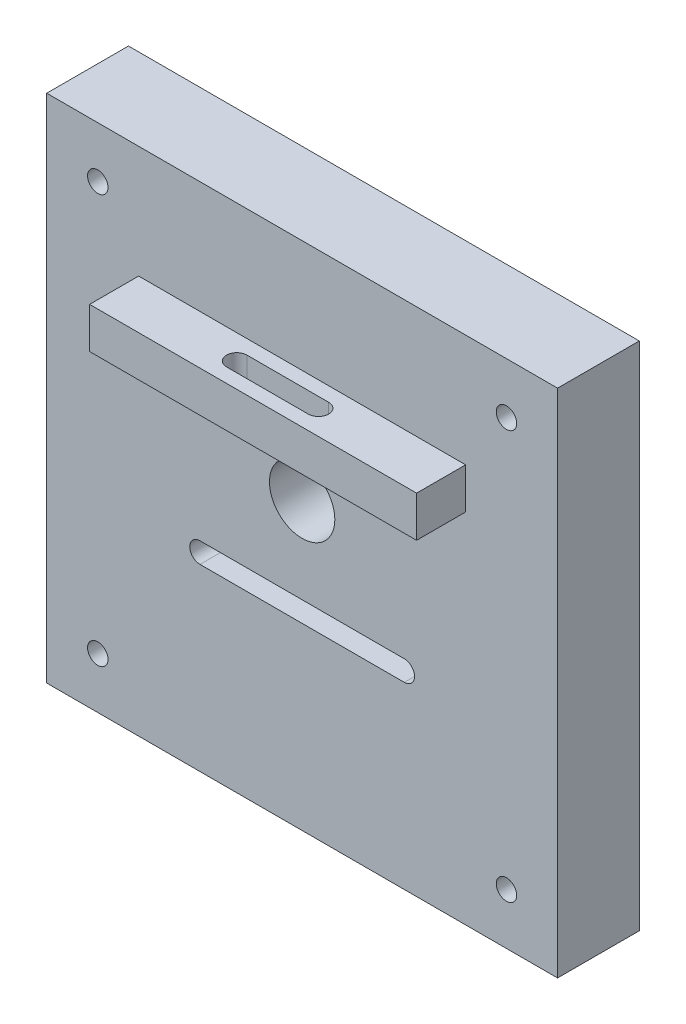
ISO-10303-21;
HEADER;
FILE_DESCRIPTION(('STEP AP214'),'2;1');
FILE_NAME('part.step','',(''),(''),'','','');
FILE_SCHEMA(('AUTOMOTIVE_DESIGN { 1 0 10303 214 1 1 1 1 }'));
ENDSEC;
DATA;
#1=APPLICATION_CONTEXT('core data for automotive mechanical design processes');
#2=APPLICATION_PROTOCOL_DEFINITION('international standard','automotive_design',2000,#1);
#3=PRODUCT_CONTEXT('',#1,'mechanical');
#4=PRODUCT('Part','Part','',(#3));
#5=PRODUCT_RELATED_PRODUCT_CATEGORY('part','',(#4));
#6=PRODUCT_DEFINITION_FORMATION('','',#4);
#7=PRODUCT_DEFINITION_CONTEXT('part definition',#1,'design');
#8=PRODUCT_DEFINITION('design','',#6,#7);
#9=PRODUCT_DEFINITION_SHAPE('','',#8);
#10=(LENGTH_UNIT() NAMED_UNIT(*) SI_UNIT(.MILLI.,.METRE.));
#11=(NAMED_UNIT(*) PLANE_ANGLE_UNIT() SI_UNIT($,.RADIAN.));
#12=(NAMED_UNIT(*) SI_UNIT($,.STERADIAN.) SOLID_ANGLE_UNIT());
#13=UNCERTAINTY_MEASURE_WITH_UNIT(LENGTH_MEASURE(1.E-05),#10,'distance_accuracy_value','');
#14=(GEOMETRIC_REPRESENTATION_CONTEXT(3) GLOBAL_UNCERTAINTY_ASSIGNED_CONTEXT((#13)) GLOBAL_UNIT_ASSIGNED_CONTEXT((#10,
#11,#12)) REPRESENTATION_CONTEXT('',''));
#15=CARTESIAN_POINT('',(0.,0.,0.));
#16=DIRECTION('',(0.,0.,1.));
#17=DIRECTION('',(1.,0.,0.));
#18=AXIS2_PLACEMENT_3D('',#15,#16,#17);
#19=CARTESIAN_POINT('',(0.,0.,20.));
#20=DIRECTION('',(0.,0.,1.));
#21=DIRECTION('',(1.,0.,0.));
#22=AXIS2_PLACEMENT_3D('',#19,#20,#21);
#23=PLANE('',#22);
#24=CARTESIAN_POINT('',(-20.8251473477407,-14.8721021611002,20.));
#25=DIRECTION('',(0.,0.,1.));
#26=DIRECTION('',(1.,0.,0.));
#27=AXIS2_PLACEMENT_3D('',#24,#25,#26);
#28=CIRCLE('',#27,2.5);
#29=CARTESIAN_POINT('',(-20.8251473477407,-12.3721021611002,20.));
#30=VERTEX_POINT('',#29);
#31=CARTESIAN_POINT('',(-20.8251473477407,-17.3721021611002,20.));
#32=VERTEX_POINT('',#31);
#33=EDGE_CURVE('E293',#30,#32,#28,.T.);
#34=ORIENTED_EDGE('',*,*,#33,.F.);
#35=DIRECTION('',(-1.,0.,0.));
#36=VECTOR('',#35,1.);
#37=CARTESIAN_POINT('',(-20.8251473477407,-12.3721021611002,20.));
#38=LINE('',#37,#36);
#39=CARTESIAN_POINT('',(29.1748526522593,-12.3721021611002,20.));
#40=VERTEX_POINT('',#39);
#41=EDGE_CURVE('E303',#40,#30,#38,.T.);
#42=ORIENTED_EDGE('',*,*,#41,.F.);
#43=CARTESIAN_POINT('',(29.1748526522593,-14.8721021611002,20.));
#44=DIRECTION('',(0.,0.,1.));
#45=DIRECTION('',(-1.,0.,0.));
#46=AXIS2_PLACEMENT_3D('',#43,#44,#45);
#47=CIRCLE('',#46,2.5);
#48=CARTESIAN_POINT('',(29.1748526522593,-17.3721021611002,20.));
#49=VERTEX_POINT('',#48);
#50=EDGE_CURVE('E300',#49,#40,#47,.T.);
#51=ORIENTED_EDGE('',*,*,#50,.F.);
#52=DIRECTION('',(1.,0.,0.));
#53=VECTOR('',#52,1.);
#54=CARTESIAN_POINT('',(29.1748526522593,-17.3721021611002,20.));
#55=LINE('',#54,#53);
#56=EDGE_CURVE('E296',#32,#49,#55,.T.);
#57=ORIENTED_EDGE('',*,*,#56,.F.);
#58=EDGE_LOOP('',(#34,#42,#51,#57));
#59=FACE_BOUND('',#58,.T.);
#60=CARTESIAN_POINT('',(4.17485265225931,8.6278978388998,20.));
#61=DIRECTION('',(0.,0.,1.));
#62=DIRECTION('',(1.,0.,0.));
#63=AXIS2_PLACEMENT_3D('',#60,#61,#62);
#64=CIRCLE('',#63,8.);
#65=CARTESIAN_POINT('',(12.1748526522593,8.6278978388998,20.));
#66=VERTEX_POINT('',#65);
#67=EDGE_CURVE('E292',#66,#66,#64,.T.);
#68=ORIENTED_EDGE('',*,*,#67,.F.);
#69=EDGE_LOOP('',(#68));
#70=FACE_BOUND('',#69,.T.);
#71=CARTESIAN_POINT('',(-45.8251473477397,-48.7721021611002,20.));
#72=DIRECTION('',(0.,0.,1.));
#73=DIRECTION('',(1.,0.,0.));
#74=AXIS2_PLACEMENT_3D('',#71,#72,#73);
#75=CIRCLE('',#74,2.5);
#76=CARTESIAN_POINT('',(-43.3251473477397,-48.7721021611002,20.));
#77=VERTEX_POINT('',#76);
#78=EDGE_CURVE('E309',#77,#77,#75,.T.);
#79=ORIENTED_EDGE('',*,*,#78,.F.);
#80=EDGE_LOOP('',(#79));
#81=FACE_BOUND('',#80,.T.);
#82=CARTESIAN_POINT('',(54.1748526522604,-48.7721021611002,20.));
#83=DIRECTION('',(0.,0.,1.));
#84=DIRECTION('',(1.,0.,0.));
#85=AXIS2_PLACEMENT_3D('',#82,#83,#84);
#86=CIRCLE('',#85,2.5);
#87=CARTESIAN_POINT('',(56.6748526522604,-48.7721021611002,20.));
#88=VERTEX_POINT('',#87);
#89=EDGE_CURVE('E329',#88,#88,#86,.T.);
#90=ORIENTED_EDGE('',*,*,#89,.F.);
#91=EDGE_LOOP('',(#90));
#92=FACE_BOUND('',#91,.T.);
#93=CARTESIAN_POINT('',(54.1748526522593,51.2278978388998,20.));
#94=DIRECTION('',(0.,0.,1.));
#95=DIRECTION('',(1.,0.,0.));
#96=AXIS2_PLACEMENT_3D('',#93,#94,#95);
#97=CIRCLE('',#96,2.5);
#98=CARTESIAN_POINT('',(56.6748526522593,51.2278978388998,20.));
#99=VERTEX_POINT('',#98);
#100=EDGE_CURVE('E323',#99,#99,#97,.T.);
#101=ORIENTED_EDGE('',*,*,#100,.F.);
#102=EDGE_LOOP('',(#101));
#103=FACE_BOUND('',#102,.T.);
#104=CARTESIAN_POINT('',(-45.8251473477407,51.2278978388998,20.));
#105=DIRECTION('',(0.,0.,1.));
#106=DIRECTION('',(1.,0.,0.));
#107=AXIS2_PLACEMENT_3D('',#104,#105,#106);
#108=CIRCLE('',#107,2.5);
#109=CARTESIAN_POINT('',(-43.3251473477407,51.2278978388998,20.));
#110=VERTEX_POINT('',#109);
#111=EDGE_CURVE('E322',#110,#110,#108,.T.);
#112=ORIENTED_EDGE('',*,*,#111,.F.);
#113=EDGE_LOOP('',(#112));
#114=FACE_BOUND('',#113,.T.);
#115=DIRECTION('',(0.,-1.,0.));
#116=VECTOR('',#115,1.);
#117=CARTESIAN_POINT('',(-58.3251473477407,63.7278978388998,20.));
#118=LINE('',#117,#116);
#119=CARTESIAN_POINT('',(-58.3251473477407,63.7278978388998,20.));
#120=VERTEX_POINT('',#119);
#121=CARTESIAN_POINT('',(-58.3251473477407,-61.2721021611002,20.));
#122=VERTEX_POINT('',#121);
#123=EDGE_CURVE('E343',#120,#122,#118,.T.);
#124=ORIENTED_EDGE('',*,*,#123,.T.);
#125=DIRECTION('',(1.,0.,0.));
#126=VECTOR('',#125,1.);
#127=CARTESIAN_POINT('',(-58.3251473477407,-61.2721021611002,20.));
#128=LINE('',#127,#126);
#129=CARTESIAN_POINT('',(66.6748526522593,-61.2721021611002,20.));
#130=VERTEX_POINT('',#129);
#131=EDGE_CURVE('E346',#122,#130,#128,.T.);
#132=ORIENTED_EDGE('',*,*,#131,.T.);
#133=DIRECTION('',(0.,1.,0.));
#134=VECTOR('',#133,1.);
#135=CARTESIAN_POINT('',(66.6748526522593,63.7278978388998,20.));
#136=LINE('',#135,#134);
#137=CARTESIAN_POINT('',(66.6748526522593,63.7278978388998,20.));
#138=VERTEX_POINT('',#137);
#139=EDGE_CURVE('E349',#130,#138,#136,.T.);
#140=ORIENTED_EDGE('',*,*,#139,.T.);
#141=DIRECTION('',(-1.,0.,0.));
#142=VECTOR('',#141,1.);
#143=CARTESIAN_POINT('',(-58.3251473477407,63.7278978388998,20.));
#144=LINE('',#143,#142);
#145=EDGE_CURVE('E351',#138,#120,#144,.T.);
#146=ORIENTED_EDGE('',*,*,#145,.T.);
#147=EDGE_LOOP('',(#124,#132,#140,#146));
#148=FACE_BOUND('',#147,.T.);
#149=DIRECTION('',(1.,0.,0.));
#150=VECTOR('',#149,1.);
#151=CARTESIAN_POINT('',(-35.8251473477407,26.2278978388998,20.));
#152=LINE('',#151,#150);
#153=CARTESIAN_POINT('',(-35.8251473477407,26.2278978388998,20.));
#154=VERTEX_POINT('',#153);
#155=CARTESIAN_POINT('',(44.1748526522593,26.2278978388998,20.));
#156=VERTEX_POINT('',#155);
#157=EDGE_CURVE('E247',#154,#156,#152,.T.);
#158=ORIENTED_EDGE('',*,*,#157,.F.);
#159=DIRECTION('',(0.,-1.,0.));
#160=VECTOR('',#159,1.);
#161=CARTESIAN_POINT('',(-35.8251473477407,26.2278978388998,20.));
#162=LINE('',#161,#160);
#163=CARTESIAN_POINT('',(-35.8251473477407,36.2278978388998,20.));
#164=VERTEX_POINT('',#163);
#165=EDGE_CURVE('E233',#164,#154,#162,.T.);
#166=ORIENTED_EDGE('',*,*,#165,.F.);
#167=DIRECTION('',(-1.,0.,0.));
#168=VECTOR('',#167,1.);
#169=CARTESIAN_POINT('',(-35.8251473477407,36.2278978388998,20.));
#170=LINE('',#169,#168);
#171=CARTESIAN_POINT('',(44.1748526522593,36.2278978388998,20.));
#172=VERTEX_POINT('',#171);
#173=EDGE_CURVE('E238',#172,#164,#170,.T.);
#174=ORIENTED_EDGE('',*,*,#173,.F.);
#175=DIRECTION('',(0.,1.,0.));
#176=VECTOR('',#175,1.);
#177=CARTESIAN_POINT('',(44.1748526522593,26.2278978388998,20.));
#178=LINE('',#177,#176);
#179=EDGE_CURVE('E249',#156,#172,#178,.T.);
#180=ORIENTED_EDGE('',*,*,#179,.F.);
#181=EDGE_LOOP('',(#158,#166,#174,#180));
#182=FACE_BOUND('',#181,.T.);
#183=ADVANCED_FACE('F36',(#59,#70,#81,#92,#103,#114,#148,#182),#23,.T.);
#184=CARTESIAN_POINT('',(-20.8251473477407,-14.8721021611002,0.));
#185=DIRECTION('',(0.,0.,1.));
#186=DIRECTION('',(1.,0.,0.));
#187=AXIS2_PLACEMENT_3D('',#184,#185,#186);
#188=CYLINDRICAL_SURFACE('',#187,2.5);
#189=CARTESIAN_POINT('',(-20.8251473477407,-14.8721021611002,10.));
#190=DIRECTION('',(0.,0.,-1.));
#191=DIRECTION('',(-1.,0.,0.));
#192=AXIS2_PLACEMENT_3D('',#189,#190,#191);
#193=CIRCLE('',#192,2.5);
#194=CARTESIAN_POINT('',(-20.8251473477407,-12.3721021611002,10.));
#195=VERTEX_POINT('',#194);
#196=CARTESIAN_POINT('',(-20.8251473477407,-17.3721021611002,10.));
#197=VERTEX_POINT('',#196);
#198=EDGE_CURVE('E290',#195,#197,#193,.F.);
#199=ORIENTED_EDGE('',*,*,#198,.F.);
#200=DIRECTION('',(0.,0.,1.));
#201=VECTOR('',#200,1.);
#202=CARTESIAN_POINT('',(-20.8251473477407,-12.3721021611002,0.));
#203=LINE('',#202,#201);
#204=EDGE_CURVE('E307',#195,#30,#203,.T.);
#205=ORIENTED_EDGE('',*,*,#204,.T.);
#206=ORIENTED_EDGE('',*,*,#33,.T.);
#207=DIRECTION('',(0.,0.,1.));
#208=VECTOR('',#207,1.);
#209=CARTESIAN_POINT('',(-20.8251473477407,-17.3721021611002,0.));
#210=LINE('',#209,#208);
#211=EDGE_CURVE('E306',#197,#32,#210,.T.);
#212=ORIENTED_EDGE('',*,*,#211,.F.);
#213=EDGE_LOOP('',(#199,#205,#206,#212));
#214=FACE_BOUND('',#213,.T.);
#215=ADVANCED_FACE('F456',(#214),#188,.F.);
#216=CARTESIAN_POINT('',(-20.8251473477407,-12.3721021611002,0.));
#217=DIRECTION('',(0.,1.,0.));
#218=DIRECTION('',(-1.,0.,0.));
#219=AXIS2_PLACEMENT_3D('',#216,#217,#218);
#220=PLANE('',#219);
#221=DIRECTION('',(-1.,0.,0.));
#222=VECTOR('',#221,1.);
#223=CARTESIAN_POINT('',(-20.8251473477407,-12.3721021611002,10.));
#224=LINE('',#223,#222);
#225=CARTESIAN_POINT('',(29.1748526522593,-12.3721021611002,10.));
#226=VERTEX_POINT('',#225);
#227=EDGE_CURVE('E288',#226,#195,#224,.T.);
#228=ORIENTED_EDGE('',*,*,#227,.F.);
#229=DIRECTION('',(0.,0.,1.));
#230=VECTOR('',#229,1.);
#231=CARTESIAN_POINT('',(29.1748526522593,-12.3721021611002,0.));
#232=LINE('',#231,#230);
#233=EDGE_CURVE('E310',#226,#40,#232,.T.);
#234=ORIENTED_EDGE('',*,*,#233,.T.);
#235=ORIENTED_EDGE('',*,*,#41,.T.);
#236=ORIENTED_EDGE('',*,*,#204,.F.);
#237=EDGE_LOOP('',(#228,#234,#235,#236));
#238=FACE_BOUND('',#237,.T.);
#239=ADVANCED_FACE('F462',(#238),#220,.F.);
#240=CARTESIAN_POINT('',(29.1748526522593,-14.8721021611002,0.));
#241=DIRECTION('',(0.,0.,1.));
#242=DIRECTION('',(1.,0.,0.));
#243=AXIS2_PLACEMENT_3D('',#240,#241,#242);
#244=CYLINDRICAL_SURFACE('',#243,2.5);
#245=CARTESIAN_POINT('',(29.1748526522593,-14.8721021611002,10.));
#246=DIRECTION('',(0.,0.,-1.));
#247=DIRECTION('',(-1.,0.,0.));
#248=AXIS2_PLACEMENT_3D('',#245,#246,#247);
#249=CIRCLE('',#248,2.5);
#250=CARTESIAN_POINT('',(29.1748526522593,-17.3721021611002,10.));
#251=VERTEX_POINT('',#250);
#252=EDGE_CURVE('E276',#251,#226,#249,.F.);
#253=ORIENTED_EDGE('',*,*,#252,.F.);
#254=DIRECTION('',(0.,0.,1.));
#255=VECTOR('',#254,1.);
#256=CARTESIAN_POINT('',(29.1748526522593,-17.3721021611002,0.));
#257=LINE('',#256,#255);
#258=EDGE_CURVE('E312',#251,#49,#257,.T.);
#259=ORIENTED_EDGE('',*,*,#258,.T.);
#260=ORIENTED_EDGE('',*,*,#50,.T.);
#261=ORIENTED_EDGE('',*,*,#233,.F.);
#262=EDGE_LOOP('',(#253,#259,#260,#261));
#263=FACE_BOUND('',#262,.T.);
#264=ADVANCED_FACE('F491',(#263),#244,.F.);
#265=CARTESIAN_POINT('',(29.1748526522593,-17.3721021611002,0.));
#266=DIRECTION('',(0.,-1.,0.));
#267=DIRECTION('',(1.,0.,0.));
#268=AXIS2_PLACEMENT_3D('',#265,#266,#267);
#269=PLANE('',#268);
#270=DIRECTION('',(1.,0.,0.));
#271=VECTOR('',#270,1.);
#272=CARTESIAN_POINT('',(29.1748526522593,-17.3721021611002,10.));
#273=LINE('',#272,#271);
#274=EDGE_CURVE('E372',#197,#251,#273,.T.);
#275=ORIENTED_EDGE('',*,*,#274,.F.);
#276=ORIENTED_EDGE('',*,*,#211,.T.);
#277=ORIENTED_EDGE('',*,*,#56,.T.);
#278=ORIENTED_EDGE('',*,*,#258,.F.);
#279=EDGE_LOOP('',(#275,#276,#277,#278));
#280=FACE_BOUND('',#279,.T.);
#281=ADVANCED_FACE('F486',(#280),#269,.F.);
#282=CARTESIAN_POINT('',(-58.3251473477407,63.7278978388998,20.));
#283=DIRECTION('',(1.,0.,0.));
#284=DIRECTION('',(0.,0.,-1.));
#285=AXIS2_PLACEMENT_3D('',#282,#283,#284);
#286=PLANE('',#285);
#287=DIRECTION('',(0.,-1.,0.));
#288=VECTOR('',#287,1.);
#289=CARTESIAN_POINT('',(-58.3251473477407,63.7278978388998,0.));
#290=LINE('',#289,#288);
#291=CARTESIAN_POINT('',(-58.3251473477407,63.7278978388998,0.));
#292=VERTEX_POINT('',#291);
#293=CARTESIAN_POINT('',(-58.3251473477407,-61.2721021611002,0.));
#294=VERTEX_POINT('',#293);
#295=EDGE_CURVE('E340',#292,#294,#290,.T.);
#296=ORIENTED_EDGE('',*,*,#295,.T.);
#297=DIRECTION('',(0.,0.,-1.));
#298=VECTOR('',#297,1.);
#299=CARTESIAN_POINT('',(-58.3251473477407,-61.2721021611002,20.));
#300=LINE('',#299,#298);
#301=EDGE_CURVE('E369',#122,#294,#300,.T.);
#302=ORIENTED_EDGE('',*,*,#301,.F.);
#303=ORIENTED_EDGE('',*,*,#123,.F.);
#304=DIRECTION('',(0.,0.,-1.));
#305=VECTOR('',#304,1.);
#306=CARTESIAN_POINT('',(-58.3251473477407,63.7278978388998,20.));
#307=LINE('',#306,#305);
#308=EDGE_CURVE('E353',#120,#292,#307,.T.);
#309=ORIENTED_EDGE('',*,*,#308,.T.);
#310=EDGE_LOOP('',(#296,#302,#303,#309));
#311=FACE_BOUND('',#310,.T.);
#312=ADVANCED_FACE('F483',(#311),#286,.F.);
#313=CARTESIAN_POINT('',(-58.3251473477407,-61.2721021611002,20.));
#314=DIRECTION('',(0.,1.,0.));
#315=DIRECTION('',(-1.,0.,0.));
#316=AXIS2_PLACEMENT_3D('',#313,#314,#315);
#317=PLANE('',#316);
#318=DIRECTION('',(1.,0.,0.));
#319=VECTOR('',#318,1.);
#320=CARTESIAN_POINT('',(-58.3251473477407,-61.2721021611002,0.));
#321=LINE('',#320,#319);
#322=CARTESIAN_POINT('',(66.6748526522593,-61.2721021611002,0.));
#323=VERTEX_POINT('',#322);
#324=EDGE_CURVE('E356',#294,#323,#321,.T.);
#325=ORIENTED_EDGE('',*,*,#324,.T.);
#326=DIRECTION('',(0.,0.,-1.));
#327=VECTOR('',#326,1.);
#328=CARTESIAN_POINT('',(66.6748526522593,-61.2721021611002,20.));
#329=LINE('',#328,#327);
#330=EDGE_CURVE('E366',#130,#323,#329,.T.);
#331=ORIENTED_EDGE('',*,*,#330,.F.);
#332=ORIENTED_EDGE('',*,*,#131,.F.);
#333=ORIENTED_EDGE('',*,*,#301,.T.);
#334=EDGE_LOOP('',(#325,#331,#332,#333));
#335=FACE_BOUND('',#334,.T.);
#336=ADVANCED_FACE('F480',(#335),#317,.F.);
#337=CARTESIAN_POINT('',(66.6748526522593,63.7278978388998,20.));
#338=DIRECTION('',(-1.,0.,0.));
#339=DIRECTION('',(0.,-1.,0.));
#340=AXIS2_PLACEMENT_3D('',#337,#338,#339);
#341=PLANE('',#340);
#342=DIRECTION('',(0.,1.,0.));
#343=VECTOR('',#342,1.);
#344=CARTESIAN_POINT('',(66.6748526522593,63.7278978388998,0.));
#345=LINE('',#344,#343);
#346=CARTESIAN_POINT('',(66.6748526522593,63.7278978388998,0.));
#347=VERTEX_POINT('',#346);
#348=EDGE_CURVE('E358',#323,#347,#345,.T.);
#349=ORIENTED_EDGE('',*,*,#348,.T.);
#350=DIRECTION('',(0.,0.,-1.));
#351=VECTOR('',#350,1.);
#352=CARTESIAN_POINT('',(66.6748526522593,63.7278978388998,20.));
#353=LINE('',#352,#351);
#354=EDGE_CURVE('E363',#138,#347,#353,.T.);
#355=ORIENTED_EDGE('',*,*,#354,.F.);
#356=ORIENTED_EDGE('',*,*,#139,.F.);
#357=ORIENTED_EDGE('',*,*,#330,.T.);
#358=EDGE_LOOP('',(#349,#355,#356,#357));
#359=FACE_BOUND('',#358,.T.);
#360=ADVANCED_FACE('F476',(#359),#341,.F.);
#361=CARTESIAN_POINT('',(-58.3251473477407,63.7278978388998,20.));
#362=DIRECTION('',(0.,-1.,0.));
#363=DIRECTION('',(0.,0.,-1.));
#364=AXIS2_PLACEMENT_3D('',#361,#362,#363);
#365=PLANE('',#364);
#366=DIRECTION('',(-1.,0.,0.));
#367=VECTOR('',#366,1.);
#368=CARTESIAN_POINT('',(-58.3251473477407,63.7278978388998,0.));
#369=LINE('',#368,#367);
#370=EDGE_CURVE('E347',#347,#292,#369,.T.);
#371=ORIENTED_EDGE('',*,*,#370,.T.);
#372=ORIENTED_EDGE('',*,*,#308,.F.);
#373=ORIENTED_EDGE('',*,*,#145,.F.);
#374=ORIENTED_EDGE('',*,*,#354,.T.);
#375=EDGE_LOOP('',(#371,#372,#373,#374));
#376=FACE_BOUND('',#375,.T.);
#377=ADVANCED_FACE('F473',(#376),#365,.F.);
#378=CARTESIAN_POINT('',(0.,0.,0.));
#379=DIRECTION('',(0.,0.,1.));
#380=DIRECTION('',(1.,0.,0.));
#381=AXIS2_PLACEMENT_3D('',#378,#379,#380);
#382=PLANE('',#381);
#383=DIRECTION('',(-1.,0.,0.));
#384=VECTOR('',#383,1.);
#385=CARTESIAN_POINT('',(39.1748526522593,-22.3721021611002,0.));
#386=LINE('',#385,#384);
#387=CARTESIAN_POINT('',(34.1748526522593,-22.3721021611002,0.));
#388=VERTEX_POINT('',#387);
#389=CARTESIAN_POINT('',(-25.8251473477407,-22.3721021611002,0.));
#390=VERTEX_POINT('',#389);
#391=EDGE_CURVE('E279',#388,#390,#386,.T.);
#392=ORIENTED_EDGE('',*,*,#391,.F.);
#393=CARTESIAN_POINT('',(34.1748526522593,-17.3721021611002,0.));
#394=DIRECTION('',(0.,0.,1.));
#395=DIRECTION('',(1.,0.,0.));
#396=AXIS2_PLACEMENT_3D('',#393,#394,#395);
#397=CIRCLE('',#396,5.);
#398=CARTESIAN_POINT('',(39.1748526522593,-17.3721021611002,0.));
#399=VERTEX_POINT('',#398);
#400=EDGE_CURVE('E404',#388,#399,#397,.T.);
#401=ORIENTED_EDGE('',*,*,#400,.T.);
#402=DIRECTION('',(0.,-1.,0.));
#403=VECTOR('',#402,1.);
#404=CARTESIAN_POINT('',(39.1748526522593,-7.3721021611002,0.));
#405=LINE('',#404,#403);
#406=CARTESIAN_POINT('',(39.1748526522593,-12.3721021611002,0.));
#407=VERTEX_POINT('',#406);
#408=EDGE_CURVE('E262',#407,#399,#405,.T.);
#409=ORIENTED_EDGE('',*,*,#408,.F.);
#410=CARTESIAN_POINT('',(34.1748526522593,-12.3721021611002,0.));
#411=DIRECTION('',(0.,0.,1.));
#412=DIRECTION('',(1.,0.,0.));
#413=AXIS2_PLACEMENT_3D('',#410,#411,#412);
#414=CIRCLE('',#413,5.);
#415=CARTESIAN_POINT('',(34.1748526522593,-7.3721021611002,0.));
#416=VERTEX_POINT('',#415);
#417=EDGE_CURVE('E11',#407,#416,#414,.T.);
#418=ORIENTED_EDGE('',*,*,#417,.T.);
#419=DIRECTION('',(1.,0.,0.));
#420=VECTOR('',#419,1.);
#421=CARTESIAN_POINT('',(39.1748526522593,-7.3721021611002,0.));
#422=LINE('',#421,#420);
#423=CARTESIAN_POINT('',(-25.8251473477407,-7.37210216110019,0.));
#424=VERTEX_POINT('',#423);
#425=EDGE_CURVE('E267',#424,#416,#422,.T.);
#426=ORIENTED_EDGE('',*,*,#425,.F.);
#427=CARTESIAN_POINT('',(-25.8251473477407,-12.3721021611002,0.));
#428=DIRECTION('',(0.,0.,1.));
#429=DIRECTION('',(1.,0.,0.));
#430=AXIS2_PLACEMENT_3D('',#427,#428,#429);
#431=CIRCLE('',#430,5.);
#432=CARTESIAN_POINT('',(-30.8251473477407,-12.3721021611002,0.));
#433=VERTEX_POINT('',#432);
#434=EDGE_CURVE('E44',#424,#433,#431,.T.);
#435=ORIENTED_EDGE('',*,*,#434,.T.);
#436=DIRECTION('',(0.,1.,0.));
#437=VECTOR('',#436,1.);
#438=CARTESIAN_POINT('',(-30.8251473477407,-7.37210216110019,0.));
#439=LINE('',#438,#437);
#440=CARTESIAN_POINT('',(-30.8251473477407,-17.3721021611002,0.));
#441=VERTEX_POINT('',#440);
#442=EDGE_CURVE('E282',#441,#433,#439,.T.);
#443=ORIENTED_EDGE('',*,*,#442,.F.);
#444=CARTESIAN_POINT('',(-25.8251473477407,-17.3721021611002,0.));
#445=DIRECTION('',(0.,0.,1.));
#446=DIRECTION('',(1.,0.,0.));
#447=AXIS2_PLACEMENT_3D('',#444,#445,#446);
#448=CIRCLE('',#447,5.);
#449=EDGE_CURVE('E402',#441,#390,#448,.T.);
#450=ORIENTED_EDGE('',*,*,#449,.T.);
#451=EDGE_LOOP('',(#392,#401,#409,#418,#426,#435,#443,#450));
#452=FACE_BOUND('',#451,.T.);
#453=CARTESIAN_POINT('',(4.17485265225931,8.6278978388998,0.));
#454=DIRECTION('',(0.,0.,1.));
#455=DIRECTION('',(1.,0.,0.));
#456=AXIS2_PLACEMENT_3D('',#453,#454,#455);
#457=CIRCLE('',#456,8.);
#458=CARTESIAN_POINT('',(12.1748526522593,8.6278978388998,0.));
#459=VERTEX_POINT('',#458);
#460=EDGE_CURVE('E297',#459,#459,#457,.T.);
#461=ORIENTED_EDGE('',*,*,#460,.T.);
#462=EDGE_LOOP('',(#461));
#463=FACE_BOUND('',#462,.T.);
#464=CARTESIAN_POINT('',(-45.8251473477397,-48.7721021611002,0.));
#465=DIRECTION('',(0.,0.,1.));
#466=DIRECTION('',(1.,0.,0.));
#467=AXIS2_PLACEMENT_3D('',#464,#465,#466);
#468=CIRCLE('',#467,2.5);
#469=CARTESIAN_POINT('',(-43.3251473477397,-48.7721021611002,0.));
#470=VERTEX_POINT('',#469);
#471=EDGE_CURVE('E332',#470,#470,#468,.T.);
#472=ORIENTED_EDGE('',*,*,#471,.T.);
#473=EDGE_LOOP('',(#472));
#474=FACE_BOUND('',#473,.T.);
#475=CARTESIAN_POINT('',(54.1748526522604,-48.7721021611002,0.));
#476=DIRECTION('',(0.,0.,1.));
#477=DIRECTION('',(1.,0.,0.));
#478=AXIS2_PLACEMENT_3D('',#475,#476,#477);
#479=CIRCLE('',#478,2.5);
#480=CARTESIAN_POINT('',(56.6748526522604,-48.7721021611002,0.));
#481=VERTEX_POINT('',#480);
#482=EDGE_CURVE('E326',#481,#481,#479,.T.);
#483=ORIENTED_EDGE('',*,*,#482,.T.);
#484=EDGE_LOOP('',(#483));
#485=FACE_BOUND('',#484,.T.);
#486=CARTESIAN_POINT('',(54.1748526522593,51.2278978388998,0.));
#487=DIRECTION('',(0.,0.,1.));
#488=DIRECTION('',(1.,0.,0.));
#489=AXIS2_PLACEMENT_3D('',#486,#487,#488);
#490=CIRCLE('',#489,2.5);
#491=CARTESIAN_POINT('',(56.6748526522593,51.2278978388998,0.));
#492=VERTEX_POINT('',#491);
#493=EDGE_CURVE('E319',#492,#492,#490,.T.);
#494=ORIENTED_EDGE('',*,*,#493,.T.);
#495=EDGE_LOOP('',(#494));
#496=FACE_BOUND('',#495,.T.);
#497=CARTESIAN_POINT('',(-45.8251473477407,51.2278978388998,0.));
#498=DIRECTION('',(0.,0.,1.));
#499=DIRECTION('',(1.,0.,0.));
#500=AXIS2_PLACEMENT_3D('',#497,#498,#499);
#501=CIRCLE('',#500,2.5);
#502=CARTESIAN_POINT('',(-43.3251473477407,51.2278978388998,0.));
#503=VERTEX_POINT('',#502);
#504=EDGE_CURVE('E337',#503,#503,#501,.T.);
#505=ORIENTED_EDGE('',*,*,#504,.T.);
#506=EDGE_LOOP('',(#505));
#507=FACE_BOUND('',#506,.T.);
#508=ORIENTED_EDGE('',*,*,#295,.F.);
#509=ORIENTED_EDGE('',*,*,#370,.F.);
#510=ORIENTED_EDGE('',*,*,#348,.F.);
#511=ORIENTED_EDGE('',*,*,#324,.F.);
#512=EDGE_LOOP('',(#508,#509,#510,#511));
#513=FACE_BOUND('',#512,.T.);
#514=ADVANCED_FACE('F409',(#452,#463,#474,#485,#496,#507,#513),#382,.F.);
#515=CARTESIAN_POINT('',(-45.8251473477407,51.2278978388998,0.));
#516=DIRECTION('',(0.,0.,1.));
#517=DIRECTION('',(1.,0.,0.));
#518=AXIS2_PLACEMENT_3D('',#515,#516,#517);
#519=CYLINDRICAL_SURFACE('',#518,2.5);
#520=ORIENTED_EDGE('',*,*,#504,.F.);
#521=EDGE_LOOP('',(#520));
#522=FACE_BOUND('',#521,.T.);
#523=ORIENTED_EDGE('',*,*,#111,.T.);
#524=EDGE_LOOP('',(#523));
#525=FACE_BOUND('',#524,.T.);
#526=ADVANCED_FACE('F469',(#522,#525),#519,.F.);
#527=CARTESIAN_POINT('',(54.1748526522593,51.2278978388998,0.));
#528=DIRECTION('',(0.,0.,1.));
#529=DIRECTION('',(1.,0.,0.));
#530=AXIS2_PLACEMENT_3D('',#527,#528,#529);
#531=CYLINDRICAL_SURFACE('',#530,2.5);
#532=ORIENTED_EDGE('',*,*,#493,.F.);
#533=EDGE_LOOP('',(#532));
#534=FACE_BOUND('',#533,.T.);
#535=ORIENTED_EDGE('',*,*,#100,.T.);
#536=EDGE_LOOP('',(#535));
#537=FACE_BOUND('',#536,.T.);
#538=ADVANCED_FACE('F561',(#534,#537),#531,.F.);
#539=CARTESIAN_POINT('',(54.1748526522604,-48.7721021611002,0.));
#540=DIRECTION('',(0.,0.,1.));
#541=DIRECTION('',(1.,0.,0.));
#542=AXIS2_PLACEMENT_3D('',#539,#540,#541);
#543=CYLINDRICAL_SURFACE('',#542,2.5);
#544=ORIENTED_EDGE('',*,*,#482,.F.);
#545=EDGE_LOOP('',(#544));
#546=FACE_BOUND('',#545,.T.);
#547=ORIENTED_EDGE('',*,*,#89,.T.);
#548=EDGE_LOOP('',(#547));
#549=FACE_BOUND('',#548,.T.);
#550=ADVANCED_FACE('F564',(#546,#549),#543,.F.);
#551=CARTESIAN_POINT('',(-45.8251473477397,-48.7721021611002,0.));
#552=DIRECTION('',(0.,0.,1.));
#553=DIRECTION('',(1.,0.,0.));
#554=AXIS2_PLACEMENT_3D('',#551,#552,#553);
#555=CYLINDRICAL_SURFACE('',#554,2.5);
#556=ORIENTED_EDGE('',*,*,#471,.F.);
#557=EDGE_LOOP('',(#556));
#558=FACE_BOUND('',#557,.T.);
#559=ORIENTED_EDGE('',*,*,#78,.T.);
#560=EDGE_LOOP('',(#559));
#561=FACE_BOUND('',#560,.T.);
#562=ADVANCED_FACE('F559',(#558,#561),#555,.F.);
#563=CARTESIAN_POINT('',(4.17485265225931,8.6278978388998,0.));
#564=DIRECTION('',(0.,0.,1.));
#565=DIRECTION('',(1.,0.,0.));
#566=AXIS2_PLACEMENT_3D('',#563,#564,#565);
#567=CYLINDRICAL_SURFACE('',#566,8.);
#568=ORIENTED_EDGE('',*,*,#460,.F.);
#569=EDGE_LOOP('',(#568));
#570=FACE_BOUND('',#569,.T.);
#571=ORIENTED_EDGE('',*,*,#67,.T.);
#572=EDGE_LOOP('',(#571));
#573=FACE_BOUND('',#572,.T.);
#574=ADVANCED_FACE('F544',(#570,#573),#567,.F.);
#575=CARTESIAN_POINT('',(0.,0.,10.));
#576=DIRECTION('',(0.,0.,-1.));
#577=DIRECTION('',(-1.,0.,0.));
#578=AXIS2_PLACEMENT_3D('',#575,#576,#577);
#579=PLANE('',#578);
#580=DIRECTION('',(-1.,0.,0.));
#581=VECTOR('',#580,1.);
#582=CARTESIAN_POINT('',(39.1748526522593,-22.3721021611002,10.));
#583=LINE('',#582,#581);
#584=CARTESIAN_POINT('',(34.1748526522593,-22.3721021611002,10.));
#585=VERTEX_POINT('',#584);
#586=CARTESIAN_POINT('',(-25.8251473477407,-22.3721021611002,10.));
#587=VERTEX_POINT('',#586);
#588=EDGE_CURVE('E266',#585,#587,#583,.T.);
#589=ORIENTED_EDGE('',*,*,#588,.T.);
#590=CARTESIAN_POINT('',(-25.8251473477407,-17.3721021611002,10.));
#591=DIRECTION('',(0.,0.,-1.));
#592=DIRECTION('',(-1.,0.,0.));
#593=AXIS2_PLACEMENT_3D('',#590,#591,#592);
#594=CIRCLE('',#593,5.);
#595=CARTESIAN_POINT('',(-30.8251473477407,-17.3721021611002,10.));
#596=VERTEX_POINT('',#595);
#597=EDGE_CURVE('E390',#587,#596,#594,.T.);
#598=ORIENTED_EDGE('',*,*,#597,.T.);
#599=DIRECTION('',(0.,1.,0.));
#600=VECTOR('',#599,1.);
#601=CARTESIAN_POINT('',(-30.8251473477407,-7.37210216110019,10.));
#602=LINE('',#601,#600);
#603=CARTESIAN_POINT('',(-30.8251473477407,-12.3721021611002,10.));
#604=VERTEX_POINT('',#603);
#605=EDGE_CURVE('E270',#596,#604,#602,.T.);
#606=ORIENTED_EDGE('',*,*,#605,.T.);
#607=CARTESIAN_POINT('',(-25.8251473477407,-12.3721021611002,10.));
#608=DIRECTION('',(0.,0.,-1.));
#609=DIRECTION('',(-1.,0.,0.));
#610=AXIS2_PLACEMENT_3D('',#607,#608,#609);
#611=CIRCLE('',#610,5.);
#612=CARTESIAN_POINT('',(-25.8251473477407,-7.37210216110019,10.));
#613=VERTEX_POINT('',#612);
#614=EDGE_CURVE('E386',#604,#613,#611,.T.);
#615=ORIENTED_EDGE('',*,*,#614,.T.);
#616=DIRECTION('',(1.,0.,0.));
#617=VECTOR('',#616,1.);
#618=CARTESIAN_POINT('',(39.1748526522593,-7.3721021611002,10.));
#619=LINE('',#618,#617);
#620=CARTESIAN_POINT('',(34.1748526522593,-7.3721021611002,10.));
#621=VERTEX_POINT('',#620);
#622=EDGE_CURVE('E273',#613,#621,#619,.T.);
#623=ORIENTED_EDGE('',*,*,#622,.T.);
#624=CARTESIAN_POINT('',(34.1748526522593,-12.3721021611002,10.));
#625=DIRECTION('',(0.,0.,-1.));
#626=DIRECTION('',(-1.,0.,0.));
#627=AXIS2_PLACEMENT_3D('',#624,#625,#626);
#628=CIRCLE('',#627,5.);
#629=CARTESIAN_POINT('',(39.1748526522593,-12.3721021611002,10.));
#630=VERTEX_POINT('',#629);
#631=EDGE_CURVE('E384',#621,#630,#628,.T.);
#632=ORIENTED_EDGE('',*,*,#631,.T.);
#633=DIRECTION('',(0.,-1.,0.));
#634=VECTOR('',#633,1.);
#635=CARTESIAN_POINT('',(39.1748526522593,-7.3721021611002,10.));
#636=LINE('',#635,#634);
#637=CARTESIAN_POINT('',(39.1748526522593,-17.3721021611002,10.));
#638=VERTEX_POINT('',#637);
#639=EDGE_CURVE('E263',#630,#638,#636,.T.);
#640=ORIENTED_EDGE('',*,*,#639,.T.);
#641=CARTESIAN_POINT('',(34.1748526522593,-17.3721021611002,10.));
#642=DIRECTION('',(0.,0.,-1.));
#643=DIRECTION('',(-1.,0.,0.));
#644=AXIS2_PLACEMENT_3D('',#641,#642,#643);
#645=CIRCLE('',#644,5.);
#646=EDGE_CURVE('E388',#638,#585,#645,.T.);
#647=ORIENTED_EDGE('',*,*,#646,.T.);
#648=EDGE_LOOP('',(#589,#598,#606,#615,#623,#632,#640,#647));
#649=FACE_BOUND('',#648,.T.);
#650=ORIENTED_EDGE('',*,*,#198,.T.);
#651=ORIENTED_EDGE('',*,*,#274,.T.);
#652=ORIENTED_EDGE('',*,*,#252,.T.);
#653=ORIENTED_EDGE('',*,*,#227,.T.);
#654=EDGE_LOOP('',(#650,#651,#652,#653));
#655=FACE_BOUND('',#654,.T.);
#656=ADVANCED_FACE('F422',(#649,#655),#579,.T.);
#657=CARTESIAN_POINT('',(39.1748526522593,-7.3721021611002,10.));
#658=DIRECTION('',(1.,0.,0.));
#659=DIRECTION('',(0.,1.,0.));
#660=AXIS2_PLACEMENT_3D('',#657,#658,#659);
#661=PLANE('',#660);
#662=ORIENTED_EDGE('',*,*,#408,.T.);
#663=DIRECTION('',(0.,0.,-1.));
#664=VECTOR('',#663,1.);
#665=CARTESIAN_POINT('',(39.1748526522593,-17.3721021611002,10.));
#666=LINE('',#665,#664);
#667=EDGE_CURVE('E395',#399,#638,#666,.F.);
#668=ORIENTED_EDGE('',*,*,#667,.T.);
#669=ORIENTED_EDGE('',*,*,#639,.F.);
#670=DIRECTION('',(0.,0.,-1.));
#671=VECTOR('',#670,1.);
#672=CARTESIAN_POINT('',(39.1748526522593,-12.3721021611002,0.));
#673=LINE('',#672,#671);
#674=EDGE_CURVE('E392',#630,#407,#673,.T.);
#675=ORIENTED_EDGE('',*,*,#674,.T.);
#676=EDGE_LOOP('',(#662,#668,#669,#675));
#677=FACE_BOUND('',#676,.T.);
#678=ADVANCED_FACE('F433',(#677),#661,.F.);
#679=CARTESIAN_POINT('',(39.1748526522593,-7.3721021611002,10.));
#680=DIRECTION('',(0.,1.,0.));
#681=DIRECTION('',(-1.,0.,0.));
#682=AXIS2_PLACEMENT_3D('',#679,#680,#681);
#683=PLANE('',#682);
#684=ORIENTED_EDGE('',*,*,#622,.F.);
#685=DIRECTION('',(0.,0.,-1.));
#686=VECTOR('',#685,1.);
#687=CARTESIAN_POINT('',(-25.8251473477407,-7.37210216110019,0.));
#688=LINE('',#687,#686);
#689=EDGE_CURVE('E399',#613,#424,#688,.T.);
#690=ORIENTED_EDGE('',*,*,#689,.T.);
#691=ORIENTED_EDGE('',*,*,#425,.T.);
#692=DIRECTION('',(0.,0.,-1.));
#693=VECTOR('',#692,1.);
#694=CARTESIAN_POINT('',(34.1748526522593,-7.3721021611002,10.));
#695=LINE('',#694,#693);
#696=EDGE_CURVE('E397',#416,#621,#695,.F.);
#697=ORIENTED_EDGE('',*,*,#696,.T.);
#698=EDGE_LOOP('',(#684,#690,#691,#697));
#699=FACE_BOUND('',#698,.T.);
#700=ADVANCED_FACE('F426',(#699),#683,.F.);
#701=CARTESIAN_POINT('',(-30.8251473477407,-7.37210216110019,10.));
#702=DIRECTION('',(-1.,0.,0.));
#703=DIRECTION('',(0.,0.,1.));
#704=AXIS2_PLACEMENT_3D('',#701,#702,#703);
#705=PLANE('',#704);
#706=ORIENTED_EDGE('',*,*,#605,.F.);
#707=DIRECTION('',(0.,0.,-1.));
#708=VECTOR('',#707,1.);
#709=CARTESIAN_POINT('',(-30.8251473477407,-17.3721021611002,0.));
#710=LINE('',#709,#708);
#711=EDGE_CURVE('E376',#596,#441,#710,.T.);
#712=ORIENTED_EDGE('',*,*,#711,.T.);
#713=ORIENTED_EDGE('',*,*,#442,.T.);
#714=DIRECTION('',(0.,0.,-1.));
#715=VECTOR('',#714,1.);
#716=CARTESIAN_POINT('',(-30.8251473477407,-12.3721021611002,10.));
#717=LINE('',#716,#715);
#718=EDGE_CURVE('E374',#433,#604,#717,.F.);
#719=ORIENTED_EDGE('',*,*,#718,.T.);
#720=EDGE_LOOP('',(#706,#712,#713,#719));
#721=FACE_BOUND('',#720,.T.);
#722=ADVANCED_FACE('F416',(#721),#705,.F.);
#723=CARTESIAN_POINT('',(39.1748526522593,-22.3721021611002,10.));
#724=DIRECTION('',(0.,-1.,0.));
#725=DIRECTION('',(1.,0.,0.));
#726=AXIS2_PLACEMENT_3D('',#723,#724,#725);
#727=PLANE('',#726);
#728=ORIENTED_EDGE('',*,*,#391,.T.);
#729=DIRECTION('',(0.,0.,-1.));
#730=VECTOR('',#729,1.);
#731=CARTESIAN_POINT('',(-25.8251473477407,-22.3721021611002,10.));
#732=LINE('',#731,#730);
#733=EDGE_CURVE('E382',#390,#587,#732,.F.);
#734=ORIENTED_EDGE('',*,*,#733,.T.);
#735=ORIENTED_EDGE('',*,*,#588,.F.);
#736=DIRECTION('',(0.,0.,-1.));
#737=VECTOR('',#736,1.);
#738=CARTESIAN_POINT('',(34.1748526522593,-22.3721021611002,0.));
#739=LINE('',#738,#737);
#740=EDGE_CURVE('E379',#585,#388,#739,.T.);
#741=ORIENTED_EDGE('',*,*,#740,.T.);
#742=EDGE_LOOP('',(#728,#734,#735,#741));
#743=FACE_BOUND('',#742,.T.);
#744=ADVANCED_FACE('F442',(#743),#727,.F.);
#745=CARTESIAN_POINT('',(-25.8251473477407,-17.3721021611002,10.));
#746=DIRECTION('',(0.,0.,1.));
#747=DIRECTION('',(1.,0.,0.));
#748=AXIS2_PLACEMENT_3D('',#745,#746,#747);
#749=CYLINDRICAL_SURFACE('',#748,5.);
#750=ORIENTED_EDGE('',*,*,#597,.F.);
#751=ORIENTED_EDGE('',*,*,#733,.F.);
#752=ORIENTED_EDGE('',*,*,#449,.F.);
#753=ORIENTED_EDGE('',*,*,#711,.F.);
#754=EDGE_LOOP('',(#750,#751,#752,#753));
#755=FACE_BOUND('',#754,.T.);
#756=ADVANCED_FACE('F445',(#755),#749,.F.);
#757=CARTESIAN_POINT('',(34.1748526522593,-17.3721021611002,10.));
#758=DIRECTION('',(0.,0.,1.));
#759=DIRECTION('',(1.,0.,0.));
#760=AXIS2_PLACEMENT_3D('',#757,#758,#759);
#761=CYLINDRICAL_SURFACE('',#760,5.);
#762=ORIENTED_EDGE('',*,*,#646,.F.);
#763=ORIENTED_EDGE('',*,*,#667,.F.);
#764=ORIENTED_EDGE('',*,*,#400,.F.);
#765=ORIENTED_EDGE('',*,*,#740,.F.);
#766=EDGE_LOOP('',(#762,#763,#764,#765));
#767=FACE_BOUND('',#766,.T.);
#768=ADVANCED_FACE('F437',(#767),#761,.F.);
#769=CARTESIAN_POINT('',(-25.8251473477407,-12.3721021611002,10.));
#770=DIRECTION('',(0.,0.,1.));
#771=DIRECTION('',(1.,0.,0.));
#772=AXIS2_PLACEMENT_3D('',#769,#770,#771);
#773=CYLINDRICAL_SURFACE('',#772,5.);
#774=ORIENTED_EDGE('',*,*,#614,.F.);
#775=ORIENTED_EDGE('',*,*,#718,.F.);
#776=ORIENTED_EDGE('',*,*,#434,.F.);
#777=ORIENTED_EDGE('',*,*,#689,.F.);
#778=EDGE_LOOP('',(#774,#775,#776,#777));
#779=FACE_BOUND('',#778,.T.);
#780=ADVANCED_FACE('F419',(#779),#773,.F.);
#781=CARTESIAN_POINT('',(34.1748526522593,-12.3721021611002,10.));
#782=DIRECTION('',(0.,0.,1.));
#783=DIRECTION('',(1.,0.,0.));
#784=AXIS2_PLACEMENT_3D('',#781,#782,#783);
#785=CYLINDRICAL_SURFACE('',#784,5.);
#786=ORIENTED_EDGE('',*,*,#631,.F.);
#787=ORIENTED_EDGE('',*,*,#696,.F.);
#788=ORIENTED_EDGE('',*,*,#417,.F.);
#789=ORIENTED_EDGE('',*,*,#674,.F.);
#790=EDGE_LOOP('',(#786,#787,#788,#789));
#791=FACE_BOUND('',#790,.T.);
#792=ADVANCED_FACE('F38',(#791),#785,.F.);
#793=CARTESIAN_POINT('',(-35.8251473477407,26.2278978388998,32.));
#794=DIRECTION('',(1.,0.,0.));
#795=DIRECTION('',(0.,0.,-1.));
#796=AXIS2_PLACEMENT_3D('',#793,#794,#795);
#797=PLANE('',#796);
#798=ORIENTED_EDGE('',*,*,#165,.T.);
#799=DIRECTION('',(0.,0.,-1.));
#800=VECTOR('',#799,1.);
#801=CARTESIAN_POINT('',(-35.8251473477407,26.2278978388998,32.));
#802=LINE('',#801,#800);
#803=CARTESIAN_POINT('',(-35.8251473477407,26.2278978388998,32.));
#804=VERTEX_POINT('',#803);
#805=EDGE_CURVE('E260',#804,#154,#802,.T.);
#806=ORIENTED_EDGE('',*,*,#805,.F.);
#807=DIRECTION('',(0.,-1.,0.));
#808=VECTOR('',#807,1.);
#809=CARTESIAN_POINT('',(-35.8251473477407,26.2278978388998,32.));
#810=LINE('',#809,#808);
#811=CARTESIAN_POINT('',(-35.8251473477407,36.2278978388998,32.));
#812=VERTEX_POINT('',#811);
#813=EDGE_CURVE('E234',#812,#804,#810,.T.);
#814=ORIENTED_EDGE('',*,*,#813,.F.);
#815=DIRECTION('',(0.,0.,-1.));
#816=VECTOR('',#815,1.);
#817=CARTESIAN_POINT('',(-35.8251473477407,36.2278978388998,32.));
#818=LINE('',#817,#816);
#819=EDGE_CURVE('E244',#812,#164,#818,.T.);
#820=ORIENTED_EDGE('',*,*,#819,.T.);
#821=EDGE_LOOP('',(#798,#806,#814,#820));
#822=FACE_BOUND('',#821,.T.);
#823=ADVANCED_FACE('F525',(#822),#797,.F.);
#824=CARTESIAN_POINT('',(-35.8251473477407,26.2278978388998,32.));
#825=DIRECTION('',(0.,1.,0.));
#826=DIRECTION('',(-1.,0.,0.));
#827=AXIS2_PLACEMENT_3D('',#824,#825,#826);
#828=PLANE('',#827);
#829=DIRECTION('',(-1.,0.,0.));
#830=VECTOR('',#829,1.);
#831=CARTESIAN_POINT('',(-35.8251473477407,26.2278978388998,23.5));
#832=LINE('',#831,#830);
#833=CARTESIAN_POINT('',(14.1748526522593,26.2278978388998,23.5));
#834=VERTEX_POINT('',#833);
#835=CARTESIAN_POINT('',(-5.82514734774068,26.2278978388998,23.5));
#836=VERTEX_POINT('',#835);
#837=EDGE_CURVE('E227',#834,#836,#832,.T.);
#838=ORIENTED_EDGE('',*,*,#837,.T.);
#839=CARTESIAN_POINT('',(-5.82514734774068,26.2278978388998,26.));
#840=DIRECTION('',(0.,1.,0.));
#841=DIRECTION('',(-1.,0.,0.));
#842=AXIS2_PLACEMENT_3D('',#839,#840,#841);
#843=CIRCLE('',#842,2.5);
#844=CARTESIAN_POINT('',(-5.82514734774068,26.2278978388998,28.5));
#845=VERTEX_POINT('',#844);
#846=EDGE_CURVE('E230',#836,#845,#843,.T.);
#847=ORIENTED_EDGE('',*,*,#846,.T.);
#848=DIRECTION('',(1.,0.,0.));
#849=VECTOR('',#848,1.);
#850=CARTESIAN_POINT('',(-35.8251473477407,26.2278978388998,28.5));
#851=LINE('',#850,#849);
#852=CARTESIAN_POINT('',(14.1748526522593,26.2278978388998,28.5));
#853=VERTEX_POINT('',#852);
#854=EDGE_CURVE('E222',#845,#853,#851,.T.);
#855=ORIENTED_EDGE('',*,*,#854,.T.);
#856=CARTESIAN_POINT('',(14.1748526522593,26.2278978388998,26.));
#857=DIRECTION('',(0.,1.,0.));
#858=DIRECTION('',(-1.,0.,0.));
#859=AXIS2_PLACEMENT_3D('',#856,#857,#858);
#860=CIRCLE('',#859,2.5);
#861=EDGE_CURVE('E202',#853,#834,#860,.T.);
#862=ORIENTED_EDGE('',*,*,#861,.T.);
#863=EDGE_LOOP('',(#838,#847,#855,#862));
#864=FACE_BOUND('',#863,.T.);
#865=ORIENTED_EDGE('',*,*,#157,.T.);
#866=DIRECTION('',(0.,0.,-1.));
#867=VECTOR('',#866,1.);
#868=CARTESIAN_POINT('',(44.1748526522593,26.2278978388998,32.));
#869=LINE('',#868,#867);
#870=CARTESIAN_POINT('',(44.1748526522593,26.2278978388998,32.));
#871=VERTEX_POINT('',#870);
#872=EDGE_CURVE('E257',#871,#156,#869,.T.);
#873=ORIENTED_EDGE('',*,*,#872,.F.);
#874=DIRECTION('',(1.,0.,0.));
#875=VECTOR('',#874,1.);
#876=CARTESIAN_POINT('',(-35.8251473477407,26.2278978388998,32.));
#877=LINE('',#876,#875);
#878=EDGE_CURVE('E237',#804,#871,#877,.T.);
#879=ORIENTED_EDGE('',*,*,#878,.F.);
#880=ORIENTED_EDGE('',*,*,#805,.T.);
#881=EDGE_LOOP('',(#865,#873,#879,#880));
#882=FACE_BOUND('',#881,.T.);
#883=ADVANCED_FACE('F513',(#864,#882),#828,.F.);
#884=CARTESIAN_POINT('',(44.1748526522593,26.2278978388998,32.));
#885=DIRECTION('',(-1.,0.,0.));
#886=DIRECTION('',(0.,0.,1.));
#887=AXIS2_PLACEMENT_3D('',#884,#885,#886);
#888=PLANE('',#887);
#889=ORIENTED_EDGE('',*,*,#179,.T.);
#890=DIRECTION('',(0.,0.,-1.));
#891=VECTOR('',#890,1.);
#892=CARTESIAN_POINT('',(44.1748526522593,36.2278978388998,32.));
#893=LINE('',#892,#891);
#894=CARTESIAN_POINT('',(44.1748526522593,36.2278978388998,32.));
#895=VERTEX_POINT('',#894);
#896=EDGE_CURVE('E255',#895,#172,#893,.T.);
#897=ORIENTED_EDGE('',*,*,#896,.F.);
#898=DIRECTION('',(0.,1.,0.));
#899=VECTOR('',#898,1.);
#900=CARTESIAN_POINT('',(44.1748526522593,26.2278978388998,32.));
#901=LINE('',#900,#899);
#902=EDGE_CURVE('E240',#871,#895,#901,.T.);
#903=ORIENTED_EDGE('',*,*,#902,.F.);
#904=ORIENTED_EDGE('',*,*,#872,.T.);
#905=EDGE_LOOP('',(#889,#897,#903,#904));
#906=FACE_BOUND('',#905,.T.);
#907=ADVANCED_FACE('F517',(#906),#888,.F.);
#908=CARTESIAN_POINT('',(-35.8251473477407,36.2278978388998,32.));
#909=DIRECTION('',(0.,-1.,0.));
#910=DIRECTION('',(0.,0.,-1.));
#911=AXIS2_PLACEMENT_3D('',#908,#909,#910);
#912=PLANE('',#911);
#913=DIRECTION('',(1.,0.,0.));
#914=VECTOR('',#913,1.);
#915=CARTESIAN_POINT('',(-5.82514734774068,36.2278978388998,28.5));
#916=LINE('',#915,#914);
#917=CARTESIAN_POINT('',(-5.82514734774068,36.2278978388998,28.5));
#918=VERTEX_POINT('',#917);
#919=CARTESIAN_POINT('',(14.1748526522593,36.2278978388998,28.5));
#920=VERTEX_POINT('',#919);
#921=EDGE_CURVE('E208',#918,#920,#916,.T.);
#922=ORIENTED_EDGE('',*,*,#921,.F.);
#923=CARTESIAN_POINT('',(-5.82514734774068,36.2278978388998,26.));
#924=DIRECTION('',(0.,1.,0.));
#925=DIRECTION('',(0.,0.,1.));
#926=AXIS2_PLACEMENT_3D('',#923,#924,#925);
#927=CIRCLE('',#926,2.5);
#928=CARTESIAN_POINT('',(-5.82514734774068,36.2278978388998,23.5));
#929=VERTEX_POINT('',#928);
#930=EDGE_CURVE('E59',#929,#918,#927,.T.);
#931=ORIENTED_EDGE('',*,*,#930,.F.);
#932=DIRECTION('',(-1.,0.,0.));
#933=VECTOR('',#932,1.);
#934=CARTESIAN_POINT('',(-5.82514734774068,36.2278978388998,23.5));
#935=LINE('',#934,#933);
#936=CARTESIAN_POINT('',(14.1748526522593,36.2278978388998,23.5));
#937=VERTEX_POINT('',#936);
#938=EDGE_CURVE('E215',#937,#929,#935,.T.);
#939=ORIENTED_EDGE('',*,*,#938,.F.);
#940=CARTESIAN_POINT('',(14.1748526522593,36.2278978388998,26.));
#941=DIRECTION('',(0.,1.,0.));
#942=DIRECTION('',(0.,0.,-1.));
#943=AXIS2_PLACEMENT_3D('',#940,#941,#942);
#944=CIRCLE('',#943,2.5);
#945=EDGE_CURVE('E199',#920,#937,#944,.T.);
#946=ORIENTED_EDGE('',*,*,#945,.F.);
#947=EDGE_LOOP('',(#922,#931,#939,#946));
#948=FACE_BOUND('',#947,.T.);
#949=ORIENTED_EDGE('',*,*,#173,.T.);
#950=ORIENTED_EDGE('',*,*,#819,.F.);
#951=DIRECTION('',(-1.,0.,0.));
#952=VECTOR('',#951,1.);
#953=CARTESIAN_POINT('',(-35.8251473477407,36.2278978388998,32.));
#954=LINE('',#953,#952);
#955=EDGE_CURVE('E242',#895,#812,#954,.T.);
#956=ORIENTED_EDGE('',*,*,#955,.F.);
#957=ORIENTED_EDGE('',*,*,#896,.T.);
#958=EDGE_LOOP('',(#949,#950,#956,#957));
#959=FACE_BOUND('',#958,.T.);
#960=ADVANCED_FACE('F212',(#948,#959),#912,.F.);
#961=CARTESIAN_POINT('',(0.,0.,32.));
#962=DIRECTION('',(0.,0.,-1.));
#963=DIRECTION('',(-1.,0.,0.));
#964=AXIS2_PLACEMENT_3D('',#961,#962,#963);
#965=PLANE('',#964);
#966=ORIENTED_EDGE('',*,*,#813,.T.);
#967=ORIENTED_EDGE('',*,*,#878,.T.);
#968=ORIENTED_EDGE('',*,*,#902,.T.);
#969=ORIENTED_EDGE('',*,*,#955,.T.);
#970=EDGE_LOOP('',(#966,#967,#968,#969));
#971=FACE_BOUND('',#970,.T.);
#972=ADVANCED_FACE('F521',(#971),#965,.F.);
#973=CARTESIAN_POINT('',(-5.82514734774068,-61.2721021611002,26.));
#974=DIRECTION('',(0.,1.,0.));
#975=DIRECTION('',(0.,0.,1.));
#976=AXIS2_PLACEMENT_3D('',#973,#974,#975);
#977=CYLINDRICAL_SURFACE('',#976,2.5);
#978=DIRECTION('',(0.,1.,0.));
#979=VECTOR('',#978,1.);
#980=CARTESIAN_POINT('',(-5.82514734774068,-61.2721021611002,23.5));
#981=LINE('',#980,#979);
#982=EDGE_CURVE('E220',#836,#929,#981,.T.);
#983=ORIENTED_EDGE('',*,*,#982,.T.);
#984=ORIENTED_EDGE('',*,*,#930,.T.);
#985=DIRECTION('',(0.,1.,0.));
#986=VECTOR('',#985,1.);
#987=CARTESIAN_POINT('',(-5.82514734774068,-61.2721021611002,28.5));
#988=LINE('',#987,#986);
#989=EDGE_CURVE('E205',#845,#918,#988,.T.);
#990=ORIENTED_EDGE('',*,*,#989,.F.);
#991=ORIENTED_EDGE('',*,*,#846,.F.);
#992=EDGE_LOOP('',(#983,#984,#990,#991));
#993=FACE_BOUND('',#992,.T.);
#994=ADVANCED_FACE('F532',(#993),#977,.F.);
#995=CARTESIAN_POINT('',(-5.82514734774068,-61.2721021611002,23.5));
#996=DIRECTION('',(0.,0.,-1.));
#997=DIRECTION('',(-1.,0.,0.));
#998=AXIS2_PLACEMENT_3D('',#995,#996,#997);
#999=PLANE('',#998);
#1000=DIRECTION('',(0.,1.,0.));
#1001=VECTOR('',#1000,1.);
#1002=CARTESIAN_POINT('',(14.1748526522593,-61.2721021611002,23.5));
#1003=LINE('',#1002,#1001);
#1004=EDGE_CURVE('E204',#834,#937,#1003,.T.);
#1005=ORIENTED_EDGE('',*,*,#1004,.T.);
#1006=ORIENTED_EDGE('',*,*,#938,.T.);
#1007=ORIENTED_EDGE('',*,*,#982,.F.);
#1008=ORIENTED_EDGE('',*,*,#837,.F.);
#1009=EDGE_LOOP('',(#1005,#1006,#1007,#1008));
#1010=FACE_BOUND('',#1009,.T.);
#1011=ADVANCED_FACE('F734',(#1010),#999,.F.);
#1012=CARTESIAN_POINT('',(14.1748526522593,-61.2721021611002,26.));
#1013=DIRECTION('',(0.,1.,0.));
#1014=DIRECTION('',(0.,0.,1.));
#1015=AXIS2_PLACEMENT_3D('',#1012,#1013,#1014);
#1016=CYLINDRICAL_SURFACE('',#1015,2.5);
#1017=DIRECTION('',(0.,1.,0.));
#1018=VECTOR('',#1017,1.);
#1019=CARTESIAN_POINT('',(14.1748526522593,-61.2721021611002,28.5));
#1020=LINE('',#1019,#1018);
#1021=EDGE_CURVE('E51',#853,#920,#1020,.T.);
#1022=ORIENTED_EDGE('',*,*,#1021,.T.);
#1023=ORIENTED_EDGE('',*,*,#945,.T.);
#1024=ORIENTED_EDGE('',*,*,#1004,.F.);
#1025=ORIENTED_EDGE('',*,*,#861,.F.);
#1026=EDGE_LOOP('',(#1022,#1023,#1024,#1025));
#1027=FACE_BOUND('',#1026,.T.);
#1028=ADVANCED_FACE('F196',(#1027),#1016,.F.);
#1029=CARTESIAN_POINT('',(-5.82514734774068,-61.2721021611002,28.5));
#1030=DIRECTION('',(0.,0.,1.));
#1031=DIRECTION('',(1.,0.,0.));
#1032=AXIS2_PLACEMENT_3D('',#1029,#1030,#1031);
#1033=PLANE('',#1032);
#1034=ORIENTED_EDGE('',*,*,#989,.T.);
#1035=ORIENTED_EDGE('',*,*,#921,.T.);
#1036=ORIENTED_EDGE('',*,*,#1021,.F.);
#1037=ORIENTED_EDGE('',*,*,#854,.F.);
#1038=EDGE_LOOP('',(#1034,#1035,#1036,#1037));
#1039=FACE_BOUND('',#1038,.T.);
#1040=ADVANCED_FACE('F209',(#1039),#1033,.F.);
#1041=CLOSED_SHELL('',(#183,#215,#239,#264,#281,#312,#336,#360,#377,#514,#526,#538,#550,#562,
#574,#656,#678,#700,#722,#744,#756,#768,#780,#792,#823,#883,#907,#960,#972,#994,#1011,#1028,#1040));
#1042=MANIFOLD_SOLID_BREP('B2',#1041);
#1043=ADVANCED_BREP_SHAPE_REPRESENTATION('',(#18,#1042),#14);
#1044=SHAPE_DEFINITION_REPRESENTATION(#9,#1043);
ENDSEC;
END-ISO-10303-21;
